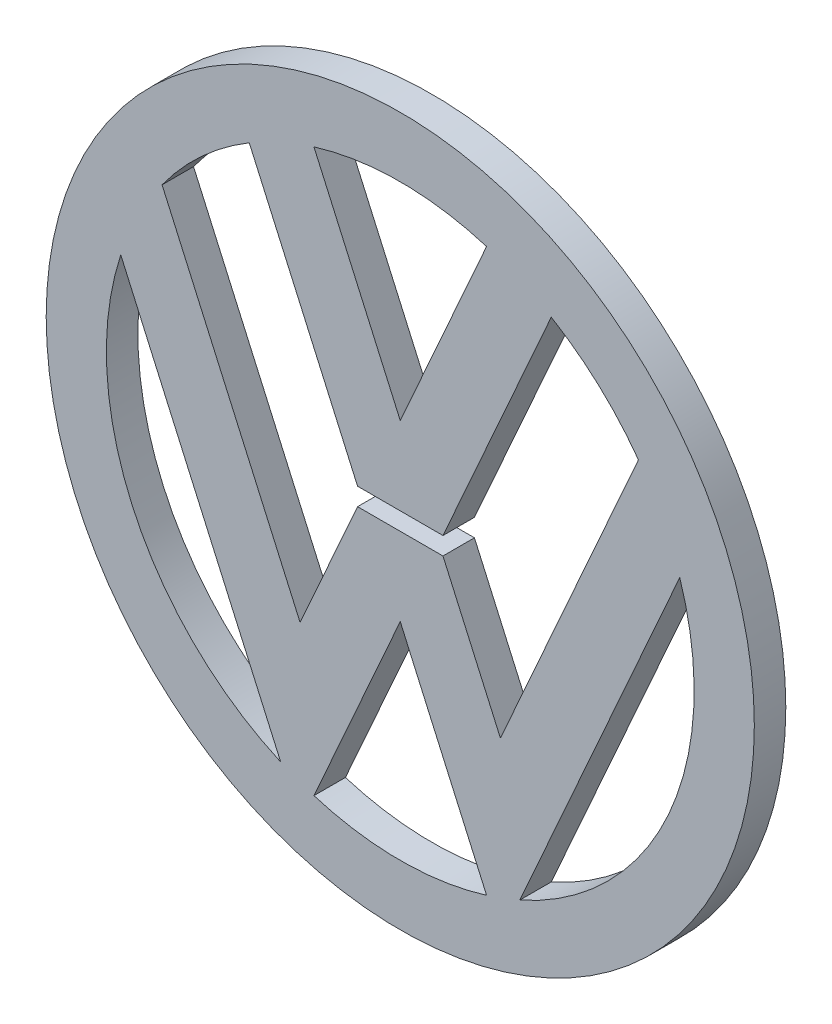
ISO-10303-21;
HEADER;
FILE_DESCRIPTION(('STEP AP214'),'2;1');
FILE_NAME('part.step','',(''),(''),'','','');
FILE_SCHEMA(('AUTOMOTIVE_DESIGN { 1 0 10303 214 1 1 1 1 }'));
ENDSEC;
DATA;
#1=APPLICATION_CONTEXT('core data for automotive mechanical design processes');
#2=APPLICATION_PROTOCOL_DEFINITION('international standard','automotive_design',2000,#1);
#3=PRODUCT_CONTEXT('',#1,'mechanical');
#4=PRODUCT('Part','Part','',(#3));
#5=PRODUCT_RELATED_PRODUCT_CATEGORY('part','',(#4));
#6=PRODUCT_DEFINITION_FORMATION('','',#4);
#7=PRODUCT_DEFINITION_CONTEXT('part definition',#1,'design');
#8=PRODUCT_DEFINITION('design','',#6,#7);
#9=PRODUCT_DEFINITION_SHAPE('','',#8);
#10=(LENGTH_UNIT() NAMED_UNIT(*) SI_UNIT(.MILLI.,.METRE.));
#11=(NAMED_UNIT(*) PLANE_ANGLE_UNIT() SI_UNIT($,.RADIAN.));
#12=(NAMED_UNIT(*) SI_UNIT($,.STERADIAN.) SOLID_ANGLE_UNIT());
#13=UNCERTAINTY_MEASURE_WITH_UNIT(LENGTH_MEASURE(1.E-05),#10,'distance_accuracy_value','');
#14=(GEOMETRIC_REPRESENTATION_CONTEXT(3) GLOBAL_UNCERTAINTY_ASSIGNED_CONTEXT((#13)) GLOBAL_UNIT_ASSIGNED_CONTEXT((#10,
#11,#12)) REPRESENTATION_CONTEXT('',''));
#15=CARTESIAN_POINT('',(0.,0.,0.));
#16=DIRECTION('',(0.,0.,1.));
#17=DIRECTION('',(1.,0.,0.));
#18=AXIS2_PLACEMENT_3D('',#15,#16,#17);
#19=CARTESIAN_POINT('',(0.,0.,4.));
#20=DIRECTION('',(0.,0.,1.));
#21=DIRECTION('',(1.,0.,0.));
#22=AXIS2_PLACEMENT_3D('',#19,#20,#21);
#23=PLANE('',#22);
#24=CARTESIAN_POINT('',(0.,0.,4.));
#25=DIRECTION('',(0.,0.,1.));
#26=DIRECTION('',(1.,0.,0.));
#27=AXIS2_PLACEMENT_3D('',#24,#25,#26);
#28=CIRCLE('',#27,45.);
#29=CARTESIAN_POINT('',(45.,0.,4.));
#30=VERTEX_POINT('',#29);
#31=EDGE_CURVE('E11',#30,#30,#28,.T.);
#32=ORIENTED_EDGE('',*,*,#31,.T.);
#33=EDGE_LOOP('',(#32));
#34=FACE_BOUND('',#33,.T.);
#35=DIRECTION('',(0.4067366430758,0.913545457642601,0.));
#36=VECTOR('',#35,1.);
#37=CARTESIAN_POINT('',(12.7286819922425,-17.525417827825,4.));
#38=LINE('',#37,#36);
#39=CARTESIAN_POINT('',(12.7286819922425,-17.525417827825,4.));
#40=VERTEX_POINT('',#39);
#41=CARTESIAN_POINT('',(30.2720167118554,21.8775570893359,4.));
#42=VERTEX_POINT('',#41);
#43=EDGE_CURVE('E252',#40,#42,#38,.T.);
#44=ORIENTED_EDGE('',*,*,#43,.F.);
#45=DIRECTION('',(0.406736643075801,-0.9135454576426,0.));
#46=VECTOR('',#45,1.);
#47=CARTESIAN_POINT('',(5.42674552424931,-1.125,4.));
#48=LINE('',#47,#46);
#49=CARTESIAN_POINT('',(5.42674552424931,-1.125,4.));
#50=VERTEX_POINT('',#49);
#51=EDGE_CURVE('E250',#50,#40,#48,.T.);
#52=ORIENTED_EDGE('',*,*,#51,.F.);
#53=DIRECTION('',(1.,0.,0.));
#54=VECTOR('',#53,1.);
#55=CARTESIAN_POINT('',(-5.42674552424931,-1.125,4.));
#56=LINE('',#55,#54);
#57=CARTESIAN_POINT('',(-5.42674552424931,-1.125,4.));
#58=VERTEX_POINT('',#57);
#59=EDGE_CURVE('E270',#58,#50,#56,.T.);
#60=ORIENTED_EDGE('',*,*,#59,.F.);
#61=DIRECTION('',(0.406736643075801,0.913545457642601,0.));
#62=VECTOR('',#61,1.);
#63=CARTESIAN_POINT('',(-5.42674552424931,-1.125,4.));
#64=LINE('',#63,#62);
#65=CARTESIAN_POINT('',(-12.7286819922426,-17.525417827825,4.));
#66=VERTEX_POINT('',#65);
#67=EDGE_CURVE('E267',#66,#58,#64,.T.);
#68=ORIENTED_EDGE('',*,*,#67,.F.);
#69=DIRECTION('',(0.406736643075801,-0.913545457642601,0.));
#70=VECTOR('',#69,1.);
#71=CARTESIAN_POINT('',(-30.2720167118554,21.8775570893358,4.));
#72=LINE('',#71,#70);
#73=CARTESIAN_POINT('',(-30.2720167118554,21.8775570893358,4.));
#74=VERTEX_POINT('',#73);
#75=EDGE_CURVE('E265',#74,#66,#72,.T.);
#76=ORIENTED_EDGE('',*,*,#75,.F.);
#77=CARTESIAN_POINT('',(0.,0.,4.));
#78=DIRECTION('',(0.,0.,1.));
#79=DIRECTION('',(1.,0.,0.));
#80=AXIS2_PLACEMENT_3D('',#77,#78,#79);
#81=CIRCLE('',#80,37.35);
#82=CARTESIAN_POINT('',(-19.1919051837641,32.042054793933,4.));
#83=VERTEX_POINT('',#82);
#84=EDGE_CURVE('E263',#83,#74,#81,.T.);
#85=ORIENTED_EDGE('',*,*,#84,.F.);
#86=DIRECTION('',(-0.406736643075801,0.913545457642601,0.));
#87=VECTOR('',#86,1.);
#88=CARTESIAN_POINT('',(-5.42674552424931,1.125,4.));
#89=LINE('',#88,#87);
#90=CARTESIAN_POINT('',(-5.42674552424931,1.125,4.));
#91=VERTEX_POINT('',#90);
#92=EDGE_CURVE('E261',#91,#83,#89,.T.);
#93=ORIENTED_EDGE('',*,*,#92,.F.);
#94=DIRECTION('',(-1.,0.,0.));
#95=VECTOR('',#94,1.);
#96=CARTESIAN_POINT('',(-5.42674552424931,1.125,4.));
#97=LINE('',#96,#95);
#98=CARTESIAN_POINT('',(5.42674552424931,1.125,4.));
#99=VERTEX_POINT('',#98);
#100=EDGE_CURVE('E259',#99,#91,#97,.T.);
#101=ORIENTED_EDGE('',*,*,#100,.F.);
#102=DIRECTION('',(-0.4067366430758,-0.913545457642601,0.));
#103=VECTOR('',#102,1.);
#104=CARTESIAN_POINT('',(5.42674552424931,1.125,4.));
#105=LINE('',#104,#103);
#106=CARTESIAN_POINT('',(19.1919051837641,32.0420547939331,4.));
#107=VERTEX_POINT('',#106);
#108=EDGE_CURVE('E257',#107,#99,#105,.T.);
#109=ORIENTED_EDGE('',*,*,#108,.F.);
#110=CARTESIAN_POINT('',(0.,0.,4.));
#111=DIRECTION('',(0.,0.,1.));
#112=DIRECTION('',(1.,0.,0.));
#113=AXIS2_PLACEMENT_3D('',#110,#111,#112);
#114=CIRCLE('',#113,37.35);
#115=EDGE_CURVE('E255',#42,#107,#114,.T.);
#116=ORIENTED_EDGE('',*,*,#115,.F.);
#117=EDGE_LOOP('',(#44,#52,#60,#68,#76,#85,#93,#101,#109,#116));
#118=FACE_BOUND('',#117,.T.);
#119=DIRECTION('',(0.406736643075801,-0.913545457642601,0.));
#120=VECTOR('',#119,1.);
#121=CARTESIAN_POINT('',(-10.9699960649807,35.7026845816152,4.));
#122=LINE('',#121,#120);
#123=CARTESIAN_POINT('',(-10.9699960649807,35.7026845816152,4.));
#124=VERTEX_POINT('',#123);
#125=CARTESIAN_POINT('',(0.,11.063670010084,4.));
#126=VERTEX_POINT('',#125);
#127=EDGE_CURVE('E228',#124,#126,#122,.T.);
#128=ORIENTED_EDGE('',*,*,#127,.F.);
#129=CARTESIAN_POINT('',(0.,0.,4.));
#130=DIRECTION('',(0.,0.,1.));
#131=DIRECTION('',(1.,0.,0.));
#132=AXIS2_PLACEMENT_3D('',#129,#130,#131);
#133=CIRCLE('',#132,37.35);
#134=CARTESIAN_POINT('',(10.9699960649807,35.7026845816153,4.));
#135=VERTEX_POINT('',#134);
#136=EDGE_CURVE('E226',#135,#124,#133,.T.);
#137=ORIENTED_EDGE('',*,*,#136,.F.);
#138=DIRECTION('',(0.4067366430758,0.913545457642601,0.));
#139=VECTOR('',#138,1.);
#140=CARTESIAN_POINT('',(0.,11.063670010084,4.));
#141=LINE('',#140,#139);
#142=EDGE_CURVE('E232',#126,#135,#141,.T.);
#143=ORIENTED_EDGE('',*,*,#142,.F.);
#144=EDGE_LOOP('',(#128,#137,#143));
#145=FACE_BOUND('',#144,.T.);
#146=DIRECTION('',(-0.406736643075802,0.9135454576426,0.));
#147=VECTOR('',#146,1.);
#148=CARTESIAN_POINT('',(0.,-11.0636700100841,4.));
#149=LINE('',#148,#147);
#150=CARTESIAN_POINT('',(10.9699960649807,-35.7026845816152,4.));
#151=VERTEX_POINT('',#150);
#152=CARTESIAN_POINT('',(0.,-11.0636700100841,4.));
#153=VERTEX_POINT('',#152);
#154=EDGE_CURVE('E204',#151,#153,#149,.T.);
#155=ORIENTED_EDGE('',*,*,#154,.F.);
#156=CARTESIAN_POINT('',(0.,0.,4.));
#157=DIRECTION('',(0.,0.,1.));
#158=DIRECTION('',(1.,0.,0.));
#159=AXIS2_PLACEMENT_3D('',#156,#157,#158);
#160=CIRCLE('',#159,37.35);
#161=CARTESIAN_POINT('',(-10.9699960649807,-35.7026845816153,4.));
#162=VERTEX_POINT('',#161);
#163=EDGE_CURVE('E202',#162,#151,#160,.T.);
#164=ORIENTED_EDGE('',*,*,#163,.F.);
#165=DIRECTION('',(-0.4067366430758,-0.913545457642601,0.));
#166=VECTOR('',#165,1.);
#167=CARTESIAN_POINT('',(-10.9699960649807,-35.7026845816153,4.));
#168=LINE('',#167,#166);
#169=EDGE_CURVE('E208',#153,#162,#168,.T.);
#170=ORIENTED_EDGE('',*,*,#169,.F.);
#171=EDGE_LOOP('',(#155,#164,#170));
#172=FACE_BOUND('',#171,.T.);
#173=DIRECTION('',(-0.406736643075801,0.9135454576426,0.));
#174=VECTOR('',#173,1.);
#175=CARTESIAN_POINT('',(-35.521960883624,11.5417847399042,4.));
#176=LINE('',#175,#174);
#177=CARTESIAN_POINT('',(-15.1916136188811,-34.1209228429511,4.));
#178=VERTEX_POINT('',#177);
#179=CARTESIAN_POINT('',(-35.521960883624,11.5417847399042,4.));
#180=VERTEX_POINT('',#179);
#181=EDGE_CURVE('E188',#178,#180,#176,.T.);
#182=ORIENTED_EDGE('',*,*,#181,.F.);
#183=CARTESIAN_POINT('',(0.,0.,4.));
#184=DIRECTION('',(0.,0.,1.));
#185=DIRECTION('',(1.,0.,0.));
#186=AXIS2_PLACEMENT_3D('',#183,#184,#185);
#187=CIRCLE('',#186,37.35);
#188=EDGE_CURVE('E185',#180,#178,#187,.T.);
#189=ORIENTED_EDGE('',*,*,#188,.F.);
#190=EDGE_LOOP('',(#182,#189));
#191=FACE_BOUND('',#190,.T.);
#192=DIRECTION('',(-0.4067366430758,-0.913545457642601,0.));
#193=VECTOR('',#192,1.);
#194=CARTESIAN_POINT('',(35.521960883624,11.5417847399043,4.));
#195=LINE('',#194,#193);
#196=CARTESIAN_POINT('',(35.521960883624,11.5417847399043,4.));
#197=VERTEX_POINT('',#196);
#198=CARTESIAN_POINT('',(15.1916136188812,-34.1209228429511,4.));
#199=VERTEX_POINT('',#198);
#200=EDGE_CURVE('E168',#197,#199,#195,.T.);
#201=ORIENTED_EDGE('',*,*,#200,.F.);
#202=CARTESIAN_POINT('',(0.,0.,4.));
#203=DIRECTION('',(0.,0.,1.));
#204=DIRECTION('',(1.,0.,0.));
#205=AXIS2_PLACEMENT_3D('',#202,#203,#204);
#206=CIRCLE('',#205,37.35);
#207=EDGE_CURVE('E174',#199,#197,#206,.T.);
#208=ORIENTED_EDGE('',*,*,#207,.F.);
#209=EDGE_LOOP('',(#201,#208));
#210=FACE_BOUND('',#209,.T.);
#211=ADVANCED_FACE('F32',(#34,#118,#145,#172,#191,#210),#23,.T.);
#212=CARTESIAN_POINT('',(0.,0.,0.));
#213=DIRECTION('',(0.,0.,1.));
#214=DIRECTION('',(1.,0.,0.));
#215=AXIS2_PLACEMENT_3D('',#212,#213,#214);
#216=PLANE('',#215);
#217=CARTESIAN_POINT('',(0.,0.,0.));
#218=DIRECTION('',(0.,0.,1.));
#219=DIRECTION('',(1.,0.,0.));
#220=AXIS2_PLACEMENT_3D('',#217,#218,#219);
#221=CIRCLE('',#220,37.35);
#222=CARTESIAN_POINT('',(-35.521960883624,11.5417847399042,0.));
#223=VERTEX_POINT('',#222);
#224=CARTESIAN_POINT('',(-15.1916136188811,-34.1209228429511,0.));
#225=VERTEX_POINT('',#224);
#226=EDGE_CURVE('E184',#223,#225,#221,.T.);
#227=ORIENTED_EDGE('',*,*,#226,.T.);
#228=DIRECTION('',(-0.406736643075801,0.9135454576426,0.));
#229=VECTOR('',#228,1.);
#230=CARTESIAN_POINT('',(-35.521960883624,11.5417847399042,0.));
#231=LINE('',#230,#229);
#232=EDGE_CURVE('E189',#225,#223,#231,.T.);
#233=ORIENTED_EDGE('',*,*,#232,.T.);
#234=EDGE_LOOP('',(#227,#233));
#235=FACE_BOUND('',#234,.T.);
#236=CARTESIAN_POINT('',(0.,0.,0.));
#237=DIRECTION('',(0.,0.,1.));
#238=DIRECTION('',(1.,0.,0.));
#239=AXIS2_PLACEMENT_3D('',#236,#237,#238);
#240=CIRCLE('',#239,37.35);
#241=CARTESIAN_POINT('',(10.9699960649807,35.7026845816153,0.));
#242=VERTEX_POINT('',#241);
#243=CARTESIAN_POINT('',(-10.9699960649807,35.7026845816152,0.));
#244=VERTEX_POINT('',#243);
#245=EDGE_CURVE('E225',#242,#244,#240,.T.);
#246=ORIENTED_EDGE('',*,*,#245,.T.);
#247=DIRECTION('',(0.406736643075801,-0.913545457642601,0.));
#248=VECTOR('',#247,1.);
#249=CARTESIAN_POINT('',(-10.9699960649807,35.7026845816152,0.));
#250=LINE('',#249,#248);
#251=CARTESIAN_POINT('',(0.,11.063670010084,0.));
#252=VERTEX_POINT('',#251);
#253=EDGE_CURVE('E237',#244,#252,#250,.T.);
#254=ORIENTED_EDGE('',*,*,#253,.T.);
#255=DIRECTION('',(0.4067366430758,0.913545457642601,0.));
#256=VECTOR('',#255,1.);
#257=CARTESIAN_POINT('',(0.,11.063670010084,0.));
#258=LINE('',#257,#256);
#259=EDGE_CURVE('E229',#252,#242,#258,.T.);
#260=ORIENTED_EDGE('',*,*,#259,.T.);
#261=EDGE_LOOP('',(#246,#254,#260));
#262=FACE_BOUND('',#261,.T.);
#263=CARTESIAN_POINT('',(0.,0.,0.));
#264=DIRECTION('',(0.,0.,1.));
#265=DIRECTION('',(1.,0.,0.));
#266=AXIS2_PLACEMENT_3D('',#263,#264,#265);
#267=CIRCLE('',#266,45.);
#268=CARTESIAN_POINT('',(45.,0.,0.));
#269=VERTEX_POINT('',#268);
#270=EDGE_CURVE('E36',#269,#269,#267,.T.);
#271=ORIENTED_EDGE('',*,*,#270,.F.);
#272=EDGE_LOOP('',(#271));
#273=FACE_BOUND('',#272,.T.);
#274=DIRECTION('',(0.406736643075801,-0.9135454576426,0.));
#275=VECTOR('',#274,1.);
#276=CARTESIAN_POINT('',(5.42674552424931,-1.125,0.));
#277=LINE('',#276,#275);
#278=CARTESIAN_POINT('',(5.42674552424931,-1.125,0.));
#279=VERTEX_POINT('',#278);
#280=CARTESIAN_POINT('',(12.7286819922425,-17.525417827825,0.));
#281=VERTEX_POINT('',#280);
#282=EDGE_CURVE('E249',#279,#281,#277,.T.);
#283=ORIENTED_EDGE('',*,*,#282,.T.);
#284=DIRECTION('',(0.4067366430758,0.913545457642601,0.));
#285=VECTOR('',#284,1.);
#286=CARTESIAN_POINT('',(12.7286819922425,-17.525417827825,0.));
#287=LINE('',#286,#285);
#288=CARTESIAN_POINT('',(30.2720167118554,21.8775570893359,0.));
#289=VERTEX_POINT('',#288);
#290=EDGE_CURVE('E275',#281,#289,#287,.T.);
#291=ORIENTED_EDGE('',*,*,#290,.T.);
#292=CARTESIAN_POINT('',(0.,0.,0.));
#293=DIRECTION('',(0.,0.,1.));
#294=DIRECTION('',(1.,0.,0.));
#295=AXIS2_PLACEMENT_3D('',#292,#293,#294);
#296=CIRCLE('',#295,37.35);
#297=CARTESIAN_POINT('',(19.1919051837641,32.0420547939331,0.));
#298=VERTEX_POINT('',#297);
#299=EDGE_CURVE('E278',#289,#298,#296,.T.);
#300=ORIENTED_EDGE('',*,*,#299,.T.);
#301=DIRECTION('',(-0.4067366430758,-0.913545457642601,0.));
#302=VECTOR('',#301,1.);
#303=CARTESIAN_POINT('',(5.42674552424931,1.125,0.));
#304=LINE('',#303,#302);
#305=CARTESIAN_POINT('',(5.42674552424931,1.125,0.));
#306=VERTEX_POINT('',#305);
#307=EDGE_CURVE('E281',#298,#306,#304,.T.);
#308=ORIENTED_EDGE('',*,*,#307,.T.);
#309=DIRECTION('',(-1.,0.,0.));
#310=VECTOR('',#309,1.);
#311=CARTESIAN_POINT('',(-5.42674552424931,1.125,0.));
#312=LINE('',#311,#310);
#313=CARTESIAN_POINT('',(-5.42674552424931,1.125,0.));
#314=VERTEX_POINT('',#313);
#315=EDGE_CURVE('E284',#306,#314,#312,.T.);
#316=ORIENTED_EDGE('',*,*,#315,.T.);
#317=DIRECTION('',(-0.406736643075801,0.913545457642601,0.));
#318=VECTOR('',#317,1.);
#319=CARTESIAN_POINT('',(-5.42674552424931,1.125,0.));
#320=LINE('',#319,#318);
#321=CARTESIAN_POINT('',(-19.1919051837641,32.042054793933,0.));
#322=VERTEX_POINT('',#321);
#323=EDGE_CURVE('E287',#314,#322,#320,.T.);
#324=ORIENTED_EDGE('',*,*,#323,.T.);
#325=CARTESIAN_POINT('',(0.,0.,0.));
#326=DIRECTION('',(0.,0.,1.));
#327=DIRECTION('',(1.,0.,0.));
#328=AXIS2_PLACEMENT_3D('',#325,#326,#327);
#329=CIRCLE('',#328,37.35);
#330=CARTESIAN_POINT('',(-30.2720167118554,21.8775570893358,0.));
#331=VERTEX_POINT('',#330);
#332=EDGE_CURVE('E290',#322,#331,#329,.T.);
#333=ORIENTED_EDGE('',*,*,#332,.T.);
#334=DIRECTION('',(0.406736643075801,-0.913545457642601,0.));
#335=VECTOR('',#334,1.);
#336=CARTESIAN_POINT('',(-30.2720167118554,21.8775570893358,0.));
#337=LINE('',#336,#335);
#338=CARTESIAN_POINT('',(-12.7286819922426,-17.525417827825,0.));
#339=VERTEX_POINT('',#338);
#340=EDGE_CURVE('E293',#331,#339,#337,.T.);
#341=ORIENTED_EDGE('',*,*,#340,.T.);
#342=DIRECTION('',(0.406736643075801,0.913545457642601,0.));
#343=VECTOR('',#342,1.);
#344=CARTESIAN_POINT('',(-5.42674552424931,-1.125,0.));
#345=LINE('',#344,#343);
#346=CARTESIAN_POINT('',(-5.42674552424931,-1.125,0.));
#347=VERTEX_POINT('',#346);
#348=EDGE_CURVE('E296',#339,#347,#345,.T.);
#349=ORIENTED_EDGE('',*,*,#348,.T.);
#350=DIRECTION('',(1.,0.,0.));
#351=VECTOR('',#350,1.);
#352=CARTESIAN_POINT('',(-5.42674552424931,-1.125,0.));
#353=LINE('',#352,#351);
#354=EDGE_CURVE('E253',#347,#279,#353,.T.);
#355=ORIENTED_EDGE('',*,*,#354,.T.);
#356=EDGE_LOOP('',(#283,#291,#300,#308,#316,#324,#333,#341,#349,#355));
#357=FACE_BOUND('',#356,.T.);
#358=CARTESIAN_POINT('',(0.,0.,0.));
#359=DIRECTION('',(0.,0.,1.));
#360=DIRECTION('',(1.,0.,0.));
#361=AXIS2_PLACEMENT_3D('',#358,#359,#360);
#362=CIRCLE('',#361,37.35);
#363=CARTESIAN_POINT('',(-10.9699960649807,-35.7026845816153,0.));
#364=VERTEX_POINT('',#363);
#365=CARTESIAN_POINT('',(10.9699960649807,-35.7026845816152,0.));
#366=VERTEX_POINT('',#365);
#367=EDGE_CURVE('E201',#364,#366,#362,.T.);
#368=ORIENTED_EDGE('',*,*,#367,.T.);
#369=DIRECTION('',(-0.406736643075802,0.9135454576426,0.));
#370=VECTOR('',#369,1.);
#371=CARTESIAN_POINT('',(0.,-11.0636700100841,0.));
#372=LINE('',#371,#370);
#373=CARTESIAN_POINT('',(0.,-11.0636700100841,0.));
#374=VERTEX_POINT('',#373);
#375=EDGE_CURVE('E213',#366,#374,#372,.T.);
#376=ORIENTED_EDGE('',*,*,#375,.T.);
#377=DIRECTION('',(-0.4067366430758,-0.913545457642601,0.));
#378=VECTOR('',#377,1.);
#379=CARTESIAN_POINT('',(-10.9699960649807,-35.7026845816153,0.));
#380=LINE('',#379,#378);
#381=EDGE_CURVE('E205',#374,#364,#380,.T.);
#382=ORIENTED_EDGE('',*,*,#381,.T.);
#383=EDGE_LOOP('',(#368,#376,#382));
#384=FACE_BOUND('',#383,.T.);
#385=CARTESIAN_POINT('',(0.,0.,0.));
#386=DIRECTION('',(0.,0.,1.));
#387=DIRECTION('',(1.,0.,0.));
#388=AXIS2_PLACEMENT_3D('',#385,#386,#387);
#389=CIRCLE('',#388,37.35);
#390=CARTESIAN_POINT('',(15.1916136188812,-34.1209228429511,0.));
#391=VERTEX_POINT('',#390);
#392=CARTESIAN_POINT('',(35.521960883624,11.5417847399043,0.));
#393=VERTEX_POINT('',#392);
#394=EDGE_CURVE('E54',#391,#393,#389,.T.);
#395=ORIENTED_EDGE('',*,*,#394,.T.);
#396=DIRECTION('',(-0.4067366430758,-0.913545457642601,0.));
#397=VECTOR('',#396,1.);
#398=CARTESIAN_POINT('',(35.521960883624,11.5417847399043,0.));
#399=LINE('',#398,#397);
#400=EDGE_CURVE('E178',#393,#391,#399,.T.);
#401=ORIENTED_EDGE('',*,*,#400,.T.);
#402=EDGE_LOOP('',(#395,#401));
#403=FACE_BOUND('',#402,.T.);
#404=ADVANCED_FACE('F327',(#235,#262,#273,#357,#384,#403),#216,.F.);
#405=CARTESIAN_POINT('',(0.,0.,4.));
#406=DIRECTION('',(0.,0.,-1.));
#407=DIRECTION('',(-1.,0.,0.));
#408=AXIS2_PLACEMENT_3D('',#405,#406,#407);
#409=CYLINDRICAL_SURFACE('',#408,45.);
#410=ORIENTED_EDGE('',*,*,#31,.F.);
#411=EDGE_LOOP('',(#410));
#412=FACE_BOUND('',#411,.T.);
#413=ORIENTED_EDGE('',*,*,#270,.T.);
#414=EDGE_LOOP('',(#413));
#415=FACE_BOUND('',#414,.T.);
#416=ADVANCED_FACE('F34',(#412,#415),#409,.T.);
#417=CARTESIAN_POINT('',(5.42674552424931,-1.125,4.));
#418=DIRECTION('',(0.9135454576426,0.406736643075801,0.));
#419=DIRECTION('',(-0.406736643075801,0.913545457642601,0.));
#420=AXIS2_PLACEMENT_3D('',#417,#418,#419);
#421=PLANE('',#420);
#422=ORIENTED_EDGE('',*,*,#282,.F.);
#423=DIRECTION('',(0.,0.,-1.));
#424=VECTOR('',#423,1.);
#425=CARTESIAN_POINT('',(5.42674552424931,-1.125,4.));
#426=LINE('',#425,#424);
#427=EDGE_CURVE('E272',#50,#279,#426,.T.);
#428=ORIENTED_EDGE('',*,*,#427,.F.);
#429=ORIENTED_EDGE('',*,*,#51,.T.);
#430=DIRECTION('',(0.,0.,-1.));
#431=VECTOR('',#430,1.);
#432=CARTESIAN_POINT('',(12.7286819922425,-17.525417827825,4.));
#433=LINE('',#432,#431);
#434=EDGE_CURVE('E319',#40,#281,#433,.T.);
#435=ORIENTED_EDGE('',*,*,#434,.T.);
#436=EDGE_LOOP('',(#422,#428,#429,#435));
#437=FACE_BOUND('',#436,.T.);
#438=ADVANCED_FACE('F364',(#437),#421,.T.);
#439=CARTESIAN_POINT('',(12.7286819922425,-17.525417827825,4.));
#440=DIRECTION('',(-0.913545457642601,0.4067366430758,0.));
#441=DIRECTION('',(-0.4067366430758,-0.913545457642601,0.));
#442=AXIS2_PLACEMENT_3D('',#439,#440,#441);
#443=PLANE('',#442);
#444=ORIENTED_EDGE('',*,*,#290,.F.);
#445=ORIENTED_EDGE('',*,*,#434,.F.);
#446=ORIENTED_EDGE('',*,*,#43,.T.);
#447=DIRECTION('',(0.,0.,-1.));
#448=VECTOR('',#447,1.);
#449=CARTESIAN_POINT('',(30.2720167118554,21.8775570893359,4.));
#450=LINE('',#449,#448);
#451=EDGE_CURVE('E317',#42,#289,#450,.T.);
#452=ORIENTED_EDGE('',*,*,#451,.T.);
#453=EDGE_LOOP('',(#444,#445,#446,#452));
#454=FACE_BOUND('',#453,.T.);
#455=ADVANCED_FACE('F367',(#454),#443,.T.);
#456=CARTESIAN_POINT('',(0.,0.,4.));
#457=DIRECTION('',(0.,0.,-1.));
#458=DIRECTION('',(-1.,0.,0.));
#459=AXIS2_PLACEMENT_3D('',#456,#457,#458);
#460=CYLINDRICAL_SURFACE('',#459,37.35);
#461=ORIENTED_EDGE('',*,*,#299,.F.);
#462=ORIENTED_EDGE('',*,*,#451,.F.);
#463=ORIENTED_EDGE('',*,*,#115,.T.);
#464=DIRECTION('',(0.,0.,-1.));
#465=VECTOR('',#464,1.);
#466=CARTESIAN_POINT('',(19.1919051837641,32.0420547939331,4.));
#467=LINE('',#466,#465);
#468=EDGE_CURVE('E315',#107,#298,#467,.T.);
#469=ORIENTED_EDGE('',*,*,#468,.T.);
#470=EDGE_LOOP('',(#461,#462,#463,#469));
#471=FACE_BOUND('',#470,.T.);
#472=ADVANCED_FACE('F370',(#471),#460,.F.);
#473=CARTESIAN_POINT('',(5.42674552424931,1.125,4.));
#474=DIRECTION('',(0.913545457642601,-0.4067366430758,0.));
#475=DIRECTION('',(0.4067366430758,0.913545457642601,0.));
#476=AXIS2_PLACEMENT_3D('',#473,#474,#475);
#477=PLANE('',#476);
#478=ORIENTED_EDGE('',*,*,#307,.F.);
#479=ORIENTED_EDGE('',*,*,#468,.F.);
#480=ORIENTED_EDGE('',*,*,#108,.T.);
#481=DIRECTION('',(0.,0.,-1.));
#482=VECTOR('',#481,1.);
#483=CARTESIAN_POINT('',(5.42674552424931,1.125,4.));
#484=LINE('',#483,#482);
#485=EDGE_CURVE('E313',#99,#306,#484,.T.);
#486=ORIENTED_EDGE('',*,*,#485,.T.);
#487=EDGE_LOOP('',(#478,#479,#480,#486));
#488=FACE_BOUND('',#487,.T.);
#489=ADVANCED_FACE('F374',(#488),#477,.T.);
#490=CARTESIAN_POINT('',(-5.42674552424931,1.125,4.));
#491=DIRECTION('',(0.,-1.,0.));
#492=DIRECTION('',(0.,0.,-1.));
#493=AXIS2_PLACEMENT_3D('',#490,#491,#492);
#494=PLANE('',#493);
#495=ORIENTED_EDGE('',*,*,#315,.F.);
#496=ORIENTED_EDGE('',*,*,#485,.F.);
#497=ORIENTED_EDGE('',*,*,#100,.T.);
#498=DIRECTION('',(0.,0.,-1.));
#499=VECTOR('',#498,1.);
#500=CARTESIAN_POINT('',(-5.42674552424931,1.125,4.));
#501=LINE('',#500,#499);
#502=EDGE_CURVE('E311',#91,#314,#501,.T.);
#503=ORIENTED_EDGE('',*,*,#502,.T.);
#504=EDGE_LOOP('',(#495,#496,#497,#503));
#505=FACE_BOUND('',#504,.T.);
#506=ADVANCED_FACE('F378',(#505),#494,.T.);
#507=CARTESIAN_POINT('',(-5.42674552424931,1.125,4.));
#508=DIRECTION('',(-0.913545457642601,-0.406736643075801,0.));
#509=DIRECTION('',(0.406736643075801,-0.913545457642601,0.));
#510=AXIS2_PLACEMENT_3D('',#507,#508,#509);
#511=PLANE('',#510);
#512=ORIENTED_EDGE('',*,*,#323,.F.);
#513=ORIENTED_EDGE('',*,*,#502,.F.);
#514=ORIENTED_EDGE('',*,*,#92,.T.);
#515=DIRECTION('',(0.,0.,-1.));
#516=VECTOR('',#515,1.);
#517=CARTESIAN_POINT('',(-19.1919051837641,32.042054793933,4.));
#518=LINE('',#517,#516);
#519=EDGE_CURVE('E309',#83,#322,#518,.T.);
#520=ORIENTED_EDGE('',*,*,#519,.T.);
#521=EDGE_LOOP('',(#512,#513,#514,#520));
#522=FACE_BOUND('',#521,.T.);
#523=ADVANCED_FACE('F382',(#522),#511,.T.);
#524=CARTESIAN_POINT('',(0.,0.,4.));
#525=DIRECTION('',(0.,0.,-1.));
#526=DIRECTION('',(-1.,0.,0.));
#527=AXIS2_PLACEMENT_3D('',#524,#525,#526);
#528=CYLINDRICAL_SURFACE('',#527,37.35);
#529=ORIENTED_EDGE('',*,*,#332,.F.);
#530=ORIENTED_EDGE('',*,*,#519,.F.);
#531=ORIENTED_EDGE('',*,*,#84,.T.);
#532=DIRECTION('',(0.,0.,-1.));
#533=VECTOR('',#532,1.);
#534=CARTESIAN_POINT('',(-30.2720167118554,21.8775570893358,4.));
#535=LINE('',#534,#533);
#536=EDGE_CURVE('E307',#74,#331,#535,.T.);
#537=ORIENTED_EDGE('',*,*,#536,.T.);
#538=EDGE_LOOP('',(#529,#530,#531,#537));
#539=FACE_BOUND('',#538,.T.);
#540=ADVANCED_FACE('F386',(#539),#528,.F.);
#541=CARTESIAN_POINT('',(-30.2720167118554,21.8775570893358,4.));
#542=DIRECTION('',(0.913545457642601,0.406736643075801,0.));
#543=DIRECTION('',(-0.406736643075801,0.913545457642601,0.));
#544=AXIS2_PLACEMENT_3D('',#541,#542,#543);
#545=PLANE('',#544);
#546=ORIENTED_EDGE('',*,*,#340,.F.);
#547=ORIENTED_EDGE('',*,*,#536,.F.);
#548=ORIENTED_EDGE('',*,*,#75,.T.);
#549=DIRECTION('',(0.,0.,-1.));
#550=VECTOR('',#549,1.);
#551=CARTESIAN_POINT('',(-12.7286819922426,-17.525417827825,4.));
#552=LINE('',#551,#550);
#553=EDGE_CURVE('E305',#66,#339,#552,.T.);
#554=ORIENTED_EDGE('',*,*,#553,.T.);
#555=EDGE_LOOP('',(#546,#547,#548,#554));
#556=FACE_BOUND('',#555,.T.);
#557=ADVANCED_FACE('F390',(#556),#545,.T.);
#558=CARTESIAN_POINT('',(-5.42674552424931,-1.125,4.));
#559=DIRECTION('',(-0.913545457642601,0.406736643075801,0.));
#560=DIRECTION('',(-0.406736643075801,-0.913545457642601,0.));
#561=AXIS2_PLACEMENT_3D('',#558,#559,#560);
#562=PLANE('',#561);
#563=ORIENTED_EDGE('',*,*,#348,.F.);
#564=ORIENTED_EDGE('',*,*,#553,.F.);
#565=ORIENTED_EDGE('',*,*,#67,.T.);
#566=DIRECTION('',(0.,0.,-1.));
#567=VECTOR('',#566,1.);
#568=CARTESIAN_POINT('',(-5.42674552424931,-1.125,4.));
#569=LINE('',#568,#567);
#570=EDGE_CURVE('E303',#58,#347,#569,.T.);
#571=ORIENTED_EDGE('',*,*,#570,.T.);
#572=EDGE_LOOP('',(#563,#564,#565,#571));
#573=FACE_BOUND('',#572,.T.);
#574=ADVANCED_FACE('F394',(#573),#562,.T.);
#575=CARTESIAN_POINT('',(-5.42674552424931,-1.125,4.));
#576=DIRECTION('',(0.,1.,0.));
#577=DIRECTION('',(0.,0.,1.));
#578=AXIS2_PLACEMENT_3D('',#575,#576,#577);
#579=PLANE('',#578);
#580=ORIENTED_EDGE('',*,*,#354,.F.);
#581=ORIENTED_EDGE('',*,*,#570,.F.);
#582=ORIENTED_EDGE('',*,*,#59,.T.);
#583=ORIENTED_EDGE('',*,*,#427,.T.);
#584=EDGE_LOOP('',(#580,#581,#582,#583));
#585=FACE_BOUND('',#584,.T.);
#586=ADVANCED_FACE('F398',(#585),#579,.T.);
#587=CARTESIAN_POINT('',(0.,0.,4.));
#588=DIRECTION('',(0.,0.,-1.));
#589=DIRECTION('',(-1.,0.,0.));
#590=AXIS2_PLACEMENT_3D('',#587,#588,#589);
#591=CYLINDRICAL_SURFACE('',#590,37.35);
#592=ORIENTED_EDGE('',*,*,#245,.F.);
#593=DIRECTION('',(0.,0.,-1.));
#594=VECTOR('',#593,1.);
#595=CARTESIAN_POINT('',(10.9699960649807,35.7026845816153,4.));
#596=LINE('',#595,#594);
#597=EDGE_CURVE('E234',#135,#242,#596,.T.);
#598=ORIENTED_EDGE('',*,*,#597,.F.);
#599=ORIENTED_EDGE('',*,*,#136,.T.);
#600=DIRECTION('',(0.,0.,-1.));
#601=VECTOR('',#600,1.);
#602=CARTESIAN_POINT('',(-10.9699960649807,35.7026845816152,4.));
#603=LINE('',#602,#601);
#604=EDGE_CURVE('E246',#124,#244,#603,.T.);
#605=ORIENTED_EDGE('',*,*,#604,.T.);
#606=EDGE_LOOP('',(#592,#598,#599,#605));
#607=FACE_BOUND('',#606,.T.);
#608=ADVANCED_FACE('F402',(#607),#591,.F.);
#609=CARTESIAN_POINT('',(-10.9699960649807,35.7026845816152,4.));
#610=DIRECTION('',(0.913545457642601,0.406736643075801,0.));
#611=DIRECTION('',(-0.406736643075801,0.913545457642601,0.));
#612=AXIS2_PLACEMENT_3D('',#609,#610,#611);
#613=PLANE('',#612);
#614=ORIENTED_EDGE('',*,*,#253,.F.);
#615=ORIENTED_EDGE('',*,*,#604,.F.);
#616=ORIENTED_EDGE('',*,*,#127,.T.);
#617=DIRECTION('',(0.,0.,-1.));
#618=VECTOR('',#617,1.);
#619=CARTESIAN_POINT('',(0.,11.063670010084,4.));
#620=LINE('',#619,#618);
#621=EDGE_CURVE('E244',#126,#252,#620,.T.);
#622=ORIENTED_EDGE('',*,*,#621,.T.);
#623=EDGE_LOOP('',(#614,#615,#616,#622));
#624=FACE_BOUND('',#623,.T.);
#625=ADVANCED_FACE('F406',(#624),#613,.T.);
#626=CARTESIAN_POINT('',(0.,11.063670010084,4.));
#627=DIRECTION('',(-0.913545457642601,0.4067366430758,0.));
#628=DIRECTION('',(-0.4067366430758,-0.913545457642601,0.));
#629=AXIS2_PLACEMENT_3D('',#626,#627,#628);
#630=PLANE('',#629);
#631=ORIENTED_EDGE('',*,*,#259,.F.);
#632=ORIENTED_EDGE('',*,*,#621,.F.);
#633=ORIENTED_EDGE('',*,*,#142,.T.);
#634=ORIENTED_EDGE('',*,*,#597,.T.);
#635=EDGE_LOOP('',(#631,#632,#633,#634));
#636=FACE_BOUND('',#635,.T.);
#637=ADVANCED_FACE('F355',(#636),#630,.T.);
#638=CARTESIAN_POINT('',(0.,0.,4.));
#639=DIRECTION('',(0.,0.,-1.));
#640=DIRECTION('',(-1.,0.,0.));
#641=AXIS2_PLACEMENT_3D('',#638,#639,#640);
#642=CYLINDRICAL_SURFACE('',#641,37.35);
#643=ORIENTED_EDGE('',*,*,#367,.F.);
#644=DIRECTION('',(0.,0.,-1.));
#645=VECTOR('',#644,1.);
#646=CARTESIAN_POINT('',(-10.9699960649807,-35.7026845816153,4.));
#647=LINE('',#646,#645);
#648=EDGE_CURVE('E210',#162,#364,#647,.T.);
#649=ORIENTED_EDGE('',*,*,#648,.F.);
#650=ORIENTED_EDGE('',*,*,#163,.T.);
#651=DIRECTION('',(0.,0.,-1.));
#652=VECTOR('',#651,1.);
#653=CARTESIAN_POINT('',(10.9699960649807,-35.7026845816152,4.));
#654=LINE('',#653,#652);
#655=EDGE_CURVE('E222',#151,#366,#654,.T.);
#656=ORIENTED_EDGE('',*,*,#655,.T.);
#657=EDGE_LOOP('',(#643,#649,#650,#656));
#658=FACE_BOUND('',#657,.T.);
#659=ADVANCED_FACE('F336',(#658),#642,.F.);
#660=CARTESIAN_POINT('',(0.,-11.0636700100841,4.));
#661=DIRECTION('',(-0.9135454576426,-0.406736643075802,0.));
#662=DIRECTION('',(0.406736643075802,-0.9135454576426,0.));
#663=AXIS2_PLACEMENT_3D('',#660,#661,#662);
#664=PLANE('',#663);
#665=ORIENTED_EDGE('',*,*,#375,.F.);
#666=ORIENTED_EDGE('',*,*,#655,.F.);
#667=ORIENTED_EDGE('',*,*,#154,.T.);
#668=DIRECTION('',(0.,0.,-1.));
#669=VECTOR('',#668,1.);
#670=CARTESIAN_POINT('',(0.,-11.0636700100841,4.));
#671=LINE('',#670,#669);
#672=EDGE_CURVE('E220',#153,#374,#671,.T.);
#673=ORIENTED_EDGE('',*,*,#672,.T.);
#674=EDGE_LOOP('',(#665,#666,#667,#673));
#675=FACE_BOUND('',#674,.T.);
#676=ADVANCED_FACE('F346',(#675),#664,.T.);
#677=CARTESIAN_POINT('',(-10.9699960649807,-35.7026845816153,4.));
#678=DIRECTION('',(0.913545457642601,-0.4067366430758,0.));
#679=DIRECTION('',(0.4067366430758,0.913545457642601,0.));
#680=AXIS2_PLACEMENT_3D('',#677,#678,#679);
#681=PLANE('',#680);
#682=ORIENTED_EDGE('',*,*,#381,.F.);
#683=ORIENTED_EDGE('',*,*,#672,.F.);
#684=ORIENTED_EDGE('',*,*,#169,.T.);
#685=ORIENTED_EDGE('',*,*,#648,.T.);
#686=EDGE_LOOP('',(#682,#683,#684,#685));
#687=FACE_BOUND('',#686,.T.);
#688=ADVANCED_FACE('F340',(#687),#681,.T.);
#689=CARTESIAN_POINT('',(0.,0.,4.));
#690=DIRECTION('',(0.,0.,-1.));
#691=DIRECTION('',(-1.,0.,0.));
#692=AXIS2_PLACEMENT_3D('',#689,#690,#691);
#693=CYLINDRICAL_SURFACE('',#692,37.35);
#694=ORIENTED_EDGE('',*,*,#226,.F.);
#695=DIRECTION('',(0.,0.,-1.));
#696=VECTOR('',#695,1.);
#697=CARTESIAN_POINT('',(-35.521960883624,11.5417847399042,4.));
#698=LINE('',#697,#696);
#699=EDGE_CURVE('E191',#180,#223,#698,.T.);
#700=ORIENTED_EDGE('',*,*,#699,.F.);
#701=ORIENTED_EDGE('',*,*,#188,.T.);
#702=DIRECTION('',(0.,0.,-1.));
#703=VECTOR('',#702,1.);
#704=CARTESIAN_POINT('',(-15.1916136188811,-34.1209228429511,4.));
#705=LINE('',#704,#703);
#706=EDGE_CURVE('E198',#178,#225,#705,.T.);
#707=ORIENTED_EDGE('',*,*,#706,.T.);
#708=EDGE_LOOP('',(#694,#700,#701,#707));
#709=FACE_BOUND('',#708,.T.);
#710=ADVANCED_FACE('F353',(#709),#693,.F.);
#711=CARTESIAN_POINT('',(-35.521960883624,11.5417847399042,4.));
#712=DIRECTION('',(-0.913545457642601,-0.406736643075801,0.));
#713=DIRECTION('',(0.406736643075801,-0.913545457642601,0.));
#714=AXIS2_PLACEMENT_3D('',#711,#712,#713);
#715=PLANE('',#714);
#716=ORIENTED_EDGE('',*,*,#232,.F.);
#717=ORIENTED_EDGE('',*,*,#706,.F.);
#718=ORIENTED_EDGE('',*,*,#181,.T.);
#719=ORIENTED_EDGE('',*,*,#699,.T.);
#720=EDGE_LOOP('',(#716,#717,#718,#719));
#721=FACE_BOUND('',#720,.T.);
#722=ADVANCED_FACE('F448',(#721),#715,.T.);
#723=CARTESIAN_POINT('',(0.,0.,4.));
#724=DIRECTION('',(0.,0.,-1.));
#725=DIRECTION('',(-1.,0.,0.));
#726=AXIS2_PLACEMENT_3D('',#723,#724,#725);
#727=CYLINDRICAL_SURFACE('',#726,37.35);
#728=ORIENTED_EDGE('',*,*,#394,.F.);
#729=DIRECTION('',(0.,0.,-1.));
#730=VECTOR('',#729,1.);
#731=CARTESIAN_POINT('',(15.1916136188812,-34.1209228429511,4.));
#732=LINE('',#731,#730);
#733=EDGE_CURVE('E170',#199,#391,#732,.T.);
#734=ORIENTED_EDGE('',*,*,#733,.F.);
#735=ORIENTED_EDGE('',*,*,#207,.T.);
#736=DIRECTION('',(0.,0.,-1.));
#737=VECTOR('',#736,1.);
#738=CARTESIAN_POINT('',(35.521960883624,11.5417847399043,4.));
#739=LINE('',#738,#737);
#740=EDGE_CURVE('E47',#197,#393,#739,.T.);
#741=ORIENTED_EDGE('',*,*,#740,.T.);
#742=EDGE_LOOP('',(#728,#734,#735,#741));
#743=FACE_BOUND('',#742,.T.);
#744=ADVANCED_FACE('F176',(#743),#727,.F.);
#745=CARTESIAN_POINT('',(35.521960883624,11.5417847399043,4.));
#746=DIRECTION('',(0.913545457642601,-0.4067366430758,0.));
#747=DIRECTION('',(0.4067366430758,0.913545457642601,0.));
#748=AXIS2_PLACEMENT_3D('',#745,#746,#747);
#749=PLANE('',#748);
#750=ORIENTED_EDGE('',*,*,#400,.F.);
#751=ORIENTED_EDGE('',*,*,#740,.F.);
#752=ORIENTED_EDGE('',*,*,#200,.T.);
#753=ORIENTED_EDGE('',*,*,#733,.T.);
#754=EDGE_LOOP('',(#750,#751,#752,#753));
#755=FACE_BOUND('',#754,.T.);
#756=ADVANCED_FACE('F169',(#755),#749,.T.);
#757=CLOSED_SHELL('',(#211,#404,#416,#438,#455,#472,#489,#506,#523,#540,#557,#574,#586,#608,
#625,#637,#659,#676,#688,#710,#722,#744,#756));
#758=MANIFOLD_SOLID_BREP('B2',#757);
#759=ADVANCED_BREP_SHAPE_REPRESENTATION('',(#18,#758),#14);
#760=SHAPE_DEFINITION_REPRESENTATION(#9,#759);
ENDSEC;
END-ISO-10303-21;
